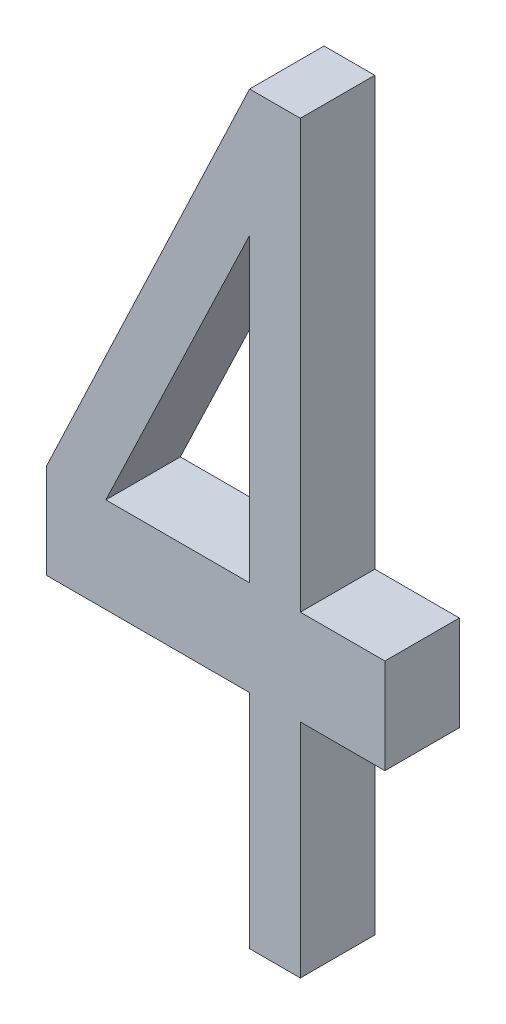
ISO-10303-21;
HEADER;
FILE_DESCRIPTION(('STEP AP214'),'2;1');
FILE_NAME('part.step','',(''),(''),'','','');
FILE_SCHEMA(('AUTOMOTIVE_DESIGN { 1 0 10303 214 1 1 1 1 }'));
ENDSEC;
DATA;
#1=APPLICATION_CONTEXT('core data for automotive mechanical design processes');
#2=APPLICATION_PROTOCOL_DEFINITION('international standard','automotive_design',2000,#1);
#3=PRODUCT_CONTEXT('',#1,'mechanical');
#4=PRODUCT('Part','Part','',(#3));
#5=PRODUCT_RELATED_PRODUCT_CATEGORY('part','',(#4));
#6=PRODUCT_DEFINITION_FORMATION('','',#4);
#7=PRODUCT_DEFINITION_CONTEXT('part definition',#1,'design');
#8=PRODUCT_DEFINITION('design','',#6,#7);
#9=PRODUCT_DEFINITION_SHAPE('','',#8);
#10=(LENGTH_UNIT() NAMED_UNIT(*) SI_UNIT(.MILLI.,.METRE.));
#11=(NAMED_UNIT(*) PLANE_ANGLE_UNIT() SI_UNIT($,.RADIAN.));
#12=(NAMED_UNIT(*) SI_UNIT($,.STERADIAN.) SOLID_ANGLE_UNIT());
#13=UNCERTAINTY_MEASURE_WITH_UNIT(LENGTH_MEASURE(1.E-05),#10,'distance_accuracy_value','');
#14=(GEOMETRIC_REPRESENTATION_CONTEXT(3) GLOBAL_UNCERTAINTY_ASSIGNED_CONTEXT((#13)) GLOBAL_UNIT_ASSIGNED_CONTEXT((#10,
#11,#12)) REPRESENTATION_CONTEXT('',''));
#15=CARTESIAN_POINT('',(0.,0.,0.));
#16=DIRECTION('',(0.,0.,1.));
#17=DIRECTION('',(1.,0.,0.));
#18=AXIS2_PLACEMENT_3D('',#15,#16,#17);
#19=CARTESIAN_POINT('',(-23.45554838855,-4.540425491333,-20.));
#20=DIRECTION('',(-1.,0.,0.));
#21=DIRECTION('',(0.,-1.,0.));
#22=AXIS2_PLACEMENT_3D('',#19,#20,#21);
#23=PLANE('',#22);
#24=DIRECTION('',(0.,-1.,0.));
#25=VECTOR('',#24,1.);
#26=CARTESIAN_POINT('',(-23.45554838855,-4.540425491333,-20.));
#27=LINE('',#26,#25);
#28=CARTESIAN_POINT('',(-23.45554838855,-4.540425491333,-20.));
#29=VERTEX_POINT('',#28);
#30=CARTESIAN_POINT('',(-23.45554838855,-5.348936152458,-20.));
#31=VERTEX_POINT('',#30);
#32=EDGE_CURVE('E11',#29,#31,#27,.T.);
#33=ORIENTED_EDGE('',*,*,#32,.T.);
#34=DIRECTION('',(0.,0.,1.));
#35=VECTOR('',#34,1.);
#36=CARTESIAN_POINT('',(-23.45554838855,-5.348936152458,-20.));
#37=LINE('',#36,#35);
#38=CARTESIAN_POINT('',(-23.45554838855,-5.348936152458,-19.8));
#39=VERTEX_POINT('',#38);
#40=EDGE_CURVE('E24',#31,#39,#37,.T.);
#41=ORIENTED_EDGE('',*,*,#40,.T.);
#42=DIRECTION('',(0.,-1.,0.));
#43=VECTOR('',#42,1.);
#44=CARTESIAN_POINT('',(-23.45554838855,-4.540425491333,-19.8));
#45=LINE('',#44,#43);
#46=CARTESIAN_POINT('',(-23.45554838855,-4.540425491333,-19.8));
#47=VERTEX_POINT('',#46);
#48=EDGE_CURVE('E222',#47,#39,#45,.T.);
#49=ORIENTED_EDGE('',*,*,#48,.F.);
#50=DIRECTION('',(0.,0.,1.));
#51=VECTOR('',#50,1.);
#52=CARTESIAN_POINT('',(-23.45554838855,-4.540425491333,-20.));
#53=LINE('',#52,#51);
#54=EDGE_CURVE('E219',#29,#47,#53,.T.);
#55=ORIENTED_EDGE('',*,*,#54,.F.);
#56=EDGE_LOOP('',(#33,#41,#49,#55));
#57=FACE_BOUND('',#56,.T.);
#58=ADVANCED_FACE('F17',(#57),#23,.T.);
#59=CARTESIAN_POINT('',(-23.45554838855,-5.348936152458,-20.));
#60=DIRECTION('',(0.,1.,0.));
#61=DIRECTION('',(-1.,0.,0.));
#62=AXIS2_PLACEMENT_3D('',#59,#60,#61);
#63=PLANE('',#62);
#64=DIRECTION('',(-1.,0.,0.));
#65=VECTOR('',#64,1.);
#66=CARTESIAN_POINT('',(-23.45554838855,-5.348936152458,-20.));
#67=LINE('',#66,#65);
#68=CARTESIAN_POINT('',(-23.84166125892,-5.348936152458,-20.));
#69=VERTEX_POINT('',#68);
#70=EDGE_CURVE('E217',#31,#69,#67,.T.);
#71=ORIENTED_EDGE('',*,*,#70,.T.);
#72=DIRECTION('',(0.,0.,1.));
#73=VECTOR('',#72,1.);
#74=CARTESIAN_POINT('',(-23.84166125892,-5.348936152458,-20.));
#75=LINE('',#74,#73);
#76=CARTESIAN_POINT('',(-23.84166125892,-5.348936152458,-19.8));
#77=VERTEX_POINT('',#76);
#78=EDGE_CURVE('E215',#69,#77,#75,.T.);
#79=ORIENTED_EDGE('',*,*,#78,.T.);
#80=DIRECTION('',(-1.,0.,0.));
#81=VECTOR('',#80,1.);
#82=CARTESIAN_POINT('',(-23.45554838855,-5.348936152458,-19.8));
#83=LINE('',#82,#81);
#84=EDGE_CURVE('E212',#39,#77,#83,.T.);
#85=ORIENTED_EDGE('',*,*,#84,.F.);
#86=ORIENTED_EDGE('',*,*,#40,.F.);
#87=EDGE_LOOP('',(#71,#79,#85,#86));
#88=FACE_BOUND('',#87,.T.);
#89=ADVANCED_FACE('F227',(#88),#63,.T.);
#90=CARTESIAN_POINT('',(-23.84166125892,-5.348936152458,-20.));
#91=DIRECTION('',(0.902380018852236,-0.430941181109717,0.));
#92=DIRECTION('',(0.430941181109717,0.902380018852236,0.));
#93=AXIS2_PLACEMENT_3D('',#90,#91,#92);
#94=PLANE('',#93);
#95=DIRECTION('',(0.430941181109717,0.902380018852236,0.));
#96=VECTOR('',#95,1.);
#97=CARTESIAN_POINT('',(-23.84166125892,-5.348936152458,-20.));
#98=LINE('',#97,#96);
#99=EDGE_CURVE('E209',#69,#29,#98,.T.);
#100=ORIENTED_EDGE('',*,*,#99,.T.);
#101=ORIENTED_EDGE('',*,*,#54,.T.);
#102=DIRECTION('',(0.430941181109717,0.902380018852236,0.));
#103=VECTOR('',#102,1.);
#104=CARTESIAN_POINT('',(-23.84166125892,-5.348936152458,-19.8));
#105=LINE('',#104,#103);
#106=EDGE_CURVE('E206',#77,#47,#105,.T.);
#107=ORIENTED_EDGE('',*,*,#106,.F.);
#108=ORIENTED_EDGE('',*,*,#78,.F.);
#109=EDGE_LOOP('',(#100,#101,#107,#108));
#110=FACE_BOUND('',#109,.T.);
#111=ADVANCED_FACE('F230',(#110),#94,.T.);
#112=CARTESIAN_POINT('',(-24.00064890761,-5.348936152458,-20.));
#113=DIRECTION('',(-1.,0.,0.));
#114=DIRECTION('',(0.,-1.,0.));
#115=AXIS2_PLACEMENT_3D('',#112,#113,#114);
#116=PLANE('',#115);
#117=DIRECTION('',(0.,-1.,0.));
#118=VECTOR('',#117,1.);
#119=CARTESIAN_POINT('',(-24.00064890761,-5.348936152458,-20.));
#120=LINE('',#119,#118);
#121=CARTESIAN_POINT('',(-24.00064890761,-5.348936152458,-20.));
#122=VERTEX_POINT('',#121);
#123=CARTESIAN_POINT('',(-24.00064890761,-5.604255330563,-20.));
#124=VERTEX_POINT('',#123);
#125=EDGE_CURVE('E204',#122,#124,#120,.T.);
#126=ORIENTED_EDGE('',*,*,#125,.T.);
#127=DIRECTION('',(0.,0.,1.));
#128=VECTOR('',#127,1.);
#129=CARTESIAN_POINT('',(-24.00064890761,-5.604255330563,-20.));
#130=LINE('',#129,#128);
#131=CARTESIAN_POINT('',(-24.00064890761,-5.604255330563,-19.8));
#132=VERTEX_POINT('',#131);
#133=EDGE_CURVE('E202',#124,#132,#130,.T.);
#134=ORIENTED_EDGE('',*,*,#133,.T.);
#135=DIRECTION('',(0.,-1.,0.));
#136=VECTOR('',#135,1.);
#137=CARTESIAN_POINT('',(-24.00064890761,-5.348936152458,-19.8));
#138=LINE('',#137,#136);
#139=CARTESIAN_POINT('',(-24.00064890761,-5.348936152458,-19.8));
#140=VERTEX_POINT('',#139);
#141=EDGE_CURVE('E200',#140,#132,#138,.T.);
#142=ORIENTED_EDGE('',*,*,#141,.F.);
#143=DIRECTION('',(0.,0.,1.));
#144=VECTOR('',#143,1.);
#145=CARTESIAN_POINT('',(-24.00064890761,-5.348936152458,-20.));
#146=LINE('',#145,#144);
#147=EDGE_CURVE('E141',#122,#140,#146,.T.);
#148=ORIENTED_EDGE('',*,*,#147,.F.);
#149=EDGE_LOOP('',(#126,#134,#142,#148));
#150=FACE_BOUND('',#149,.T.);
#151=ADVANCED_FACE('F247',(#150),#116,.T.);
#152=CARTESIAN_POINT('',(-24.00064890761,-5.604255330563,-20.));
#153=DIRECTION('',(0.,-1.,0.));
#154=DIRECTION('',(1.,0.,0.));
#155=AXIS2_PLACEMENT_3D('',#152,#153,#154);
#156=PLANE('',#155);
#157=DIRECTION('',(1.,0.,0.));
#158=VECTOR('',#157,1.);
#159=CARTESIAN_POINT('',(-24.00064890761,-5.604255330563,-20.));
#160=LINE('',#159,#158);
#161=CARTESIAN_POINT('',(-23.45554838855,-5.604255330563,-20.));
#162=VERTEX_POINT('',#161);
#163=EDGE_CURVE('E197',#124,#162,#160,.T.);
#164=ORIENTED_EDGE('',*,*,#163,.T.);
#165=DIRECTION('',(0.,0.,1.));
#166=VECTOR('',#165,1.);
#167=CARTESIAN_POINT('',(-23.45554838855,-5.604255330563,-20.));
#168=LINE('',#167,#166);
#169=CARTESIAN_POINT('',(-23.45554838855,-5.604255330563,-19.8));
#170=VERTEX_POINT('',#169);
#171=EDGE_CURVE('E195',#162,#170,#168,.T.);
#172=ORIENTED_EDGE('',*,*,#171,.T.);
#173=DIRECTION('',(1.,0.,0.));
#174=VECTOR('',#173,1.);
#175=CARTESIAN_POINT('',(-24.00064890761,-5.604255330563,-19.8));
#176=LINE('',#175,#174);
#177=EDGE_CURVE('E192',#132,#170,#176,.T.);
#178=ORIENTED_EDGE('',*,*,#177,.F.);
#179=ORIENTED_EDGE('',*,*,#133,.F.);
#180=EDGE_LOOP('',(#164,#172,#178,#179));
#181=FACE_BOUND('',#180,.T.);
#182=ADVANCED_FACE('F252',(#181),#156,.T.);
#183=CARTESIAN_POINT('',(-23.45554838855,-5.604255330563,-20.));
#184=DIRECTION('',(-1.,0.,0.));
#185=DIRECTION('',(0.,-1.,0.));
#186=AXIS2_PLACEMENT_3D('',#183,#184,#185);
#187=PLANE('',#186);
#188=DIRECTION('',(0.,-1.,0.));
#189=VECTOR('',#188,1.);
#190=CARTESIAN_POINT('',(-23.45554838855,-5.604255330563,-20.));
#191=LINE('',#190,#189);
#192=CARTESIAN_POINT('',(-23.45554838855,-6.2,-20.));
#193=VERTEX_POINT('',#192);
#194=EDGE_CURVE('E190',#162,#193,#191,.T.);
#195=ORIENTED_EDGE('',*,*,#194,.T.);
#196=DIRECTION('',(0.,0.,1.));
#197=VECTOR('',#196,1.);
#198=CARTESIAN_POINT('',(-23.45554838855,-6.2,-20.));
#199=LINE('',#198,#197);
#200=CARTESIAN_POINT('',(-23.45554838855,-6.2,-19.8));
#201=VERTEX_POINT('',#200);
#202=EDGE_CURVE('E188',#193,#201,#199,.T.);
#203=ORIENTED_EDGE('',*,*,#202,.T.);
#204=DIRECTION('',(0.,-1.,0.));
#205=VECTOR('',#204,1.);
#206=CARTESIAN_POINT('',(-23.45554838855,-5.604255330563,-19.8));
#207=LINE('',#206,#205);
#208=EDGE_CURVE('E185',#170,#201,#207,.T.);
#209=ORIENTED_EDGE('',*,*,#208,.F.);
#210=ORIENTED_EDGE('',*,*,#171,.F.);
#211=EDGE_LOOP('',(#195,#203,#209,#210));
#212=FACE_BOUND('',#211,.T.);
#213=ADVANCED_FACE('F256',(#212),#187,.T.);
#214=CARTESIAN_POINT('',(-23.45554838855,-6.2,-20.));
#215=DIRECTION('',(0.,-1.,0.));
#216=DIRECTION('',(1.,0.,0.));
#217=AXIS2_PLACEMENT_3D('',#214,#215,#216);
#218=PLANE('',#217);
#219=DIRECTION('',(1.,0.,0.));
#220=VECTOR('',#219,1.);
#221=CARTESIAN_POINT('',(-23.45554838855,-6.2,-20.));
#222=LINE('',#221,#220);
#223=CARTESIAN_POINT('',(-23.31927324254,-6.2,-20.));
#224=VERTEX_POINT('',#223);
#225=EDGE_CURVE('E183',#193,#224,#222,.T.);
#226=ORIENTED_EDGE('',*,*,#225,.T.);
#227=DIRECTION('',(0.,0.,1.));
#228=VECTOR('',#227,1.);
#229=CARTESIAN_POINT('',(-23.31927324254,-6.2,-20.));
#230=LINE('',#229,#228);
#231=CARTESIAN_POINT('',(-23.31927324254,-6.2,-19.8));
#232=VERTEX_POINT('',#231);
#233=EDGE_CURVE('E181',#224,#232,#230,.T.);
#234=ORIENTED_EDGE('',*,*,#233,.T.);
#235=DIRECTION('',(1.,0.,0.));
#236=VECTOR('',#235,1.);
#237=CARTESIAN_POINT('',(-23.45554838855,-6.2,-19.8));
#238=LINE('',#237,#236);
#239=EDGE_CURVE('E178',#201,#232,#238,.T.);
#240=ORIENTED_EDGE('',*,*,#239,.F.);
#241=ORIENTED_EDGE('',*,*,#202,.F.);
#242=EDGE_LOOP('',(#226,#234,#240,#241));
#243=FACE_BOUND('',#242,.T.);
#244=ADVANCED_FACE('F260',(#243),#218,.T.);
#245=CARTESIAN_POINT('',(-23.31927324254,-6.2,-20.));
#246=DIRECTION('',(1.,0.,0.));
#247=DIRECTION('',(0.,1.,0.));
#248=AXIS2_PLACEMENT_3D('',#245,#246,#247);
#249=PLANE('',#248);
#250=DIRECTION('',(0.,1.,0.));
#251=VECTOR('',#250,1.);
#252=CARTESIAN_POINT('',(-23.31927324254,-6.2,-20.));
#253=LINE('',#252,#251);
#254=CARTESIAN_POINT('',(-23.31927324254,-5.604255330563,-20.));
#255=VERTEX_POINT('',#254);
#256=EDGE_CURVE('E176',#224,#255,#253,.T.);
#257=ORIENTED_EDGE('',*,*,#256,.T.);
#258=DIRECTION('',(0.,0.,1.));
#259=VECTOR('',#258,1.);
#260=CARTESIAN_POINT('',(-23.31927324254,-5.604255330563,-20.));
#261=LINE('',#260,#259);
#262=CARTESIAN_POINT('',(-23.31927324254,-5.604255330563,-19.8));
#263=VERTEX_POINT('',#262);
#264=EDGE_CURVE('E174',#255,#263,#261,.T.);
#265=ORIENTED_EDGE('',*,*,#264,.T.);
#266=DIRECTION('',(0.,1.,0.));
#267=VECTOR('',#266,1.);
#268=CARTESIAN_POINT('',(-23.31927324254,-6.2,-19.8));
#269=LINE('',#268,#267);
#270=EDGE_CURVE('E171',#232,#263,#269,.T.);
#271=ORIENTED_EDGE('',*,*,#270,.F.);
#272=ORIENTED_EDGE('',*,*,#233,.F.);
#273=EDGE_LOOP('',(#257,#265,#271,#272));
#274=FACE_BOUND('',#273,.T.);
#275=ADVANCED_FACE('F264',(#274),#249,.T.);
#276=CARTESIAN_POINT('',(-23.31927324254,-5.604255330563,-20.));
#277=DIRECTION('',(0.,-1.,0.));
#278=DIRECTION('',(1.,0.,0.));
#279=AXIS2_PLACEMENT_3D('',#276,#277,#278);
#280=PLANE('',#279);
#281=DIRECTION('',(1.,0.,0.));
#282=VECTOR('',#281,1.);
#283=CARTESIAN_POINT('',(-23.31927324254,-5.604255330563,-20.));
#284=LINE('',#283,#282);
#285=CARTESIAN_POINT('',(-23.09214795587,-5.604255330563,-20.));
#286=VERTEX_POINT('',#285);
#287=EDGE_CURVE('E169',#255,#286,#284,.T.);
#288=ORIENTED_EDGE('',*,*,#287,.T.);
#289=DIRECTION('',(0.,0.,1.));
#290=VECTOR('',#289,1.);
#291=CARTESIAN_POINT('',(-23.09214795587,-5.604255330563,-20.));
#292=LINE('',#291,#290);
#293=CARTESIAN_POINT('',(-23.09214795587,-5.604255330563,-19.8));
#294=VERTEX_POINT('',#293);
#295=EDGE_CURVE('E167',#286,#294,#292,.T.);
#296=ORIENTED_EDGE('',*,*,#295,.T.);
#297=DIRECTION('',(1.,0.,0.));
#298=VECTOR('',#297,1.);
#299=CARTESIAN_POINT('',(-23.31927324254,-5.604255330563,-19.8));
#300=LINE('',#299,#298);
#301=EDGE_CURVE('E164',#263,#294,#300,.T.);
#302=ORIENTED_EDGE('',*,*,#301,.F.);
#303=ORIENTED_EDGE('',*,*,#264,.F.);
#304=EDGE_LOOP('',(#288,#296,#302,#303));
#305=FACE_BOUND('',#304,.T.);
#306=ADVANCED_FACE('F268',(#305),#280,.T.);
#307=CARTESIAN_POINT('',(-23.09214795587,-5.604255330563,-20.));
#308=DIRECTION('',(1.,0.,0.));
#309=DIRECTION('',(0.,1.,0.));
#310=AXIS2_PLACEMENT_3D('',#307,#308,#309);
#311=PLANE('',#310);
#312=DIRECTION('',(0.,1.,0.));
#313=VECTOR('',#312,1.);
#314=CARTESIAN_POINT('',(-23.09214795587,-5.604255330563,-20.));
#315=LINE('',#314,#313);
#316=CARTESIAN_POINT('',(-23.09214795587,-5.348936152458,-20.));
#317=VERTEX_POINT('',#316);
#318=EDGE_CURVE('E162',#286,#317,#315,.T.);
#319=ORIENTED_EDGE('',*,*,#318,.T.);
#320=DIRECTION('',(0.,0.,1.));
#321=VECTOR('',#320,1.);
#322=CARTESIAN_POINT('',(-23.09214795587,-5.348936152458,-20.));
#323=LINE('',#322,#321);
#324=CARTESIAN_POINT('',(-23.09214795587,-5.348936152458,-19.8));
#325=VERTEX_POINT('',#324);
#326=EDGE_CURVE('E160',#317,#325,#323,.T.);
#327=ORIENTED_EDGE('',*,*,#326,.T.);
#328=DIRECTION('',(0.,1.,0.));
#329=VECTOR('',#328,1.);
#330=CARTESIAN_POINT('',(-23.09214795587,-5.604255330563,-19.8));
#331=LINE('',#330,#329);
#332=EDGE_CURVE('E157',#294,#325,#331,.T.);
#333=ORIENTED_EDGE('',*,*,#332,.F.);
#334=ORIENTED_EDGE('',*,*,#295,.F.);
#335=EDGE_LOOP('',(#319,#327,#333,#334));
#336=FACE_BOUND('',#335,.T.);
#337=ADVANCED_FACE('F272',(#336),#311,.T.);
#338=CARTESIAN_POINT('',(-23.09214795587,-5.348936152458,-20.));
#339=DIRECTION('',(0.,1.,0.));
#340=DIRECTION('',(-1.,0.,0.));
#341=AXIS2_PLACEMENT_3D('',#338,#339,#340);
#342=PLANE('',#341);
#343=DIRECTION('',(-1.,0.,0.));
#344=VECTOR('',#343,1.);
#345=CARTESIAN_POINT('',(-23.09214795587,-5.348936152458,-20.));
#346=LINE('',#345,#344);
#347=CARTESIAN_POINT('',(-23.31927324254,-5.348936152458,-20.));
#348=VERTEX_POINT('',#347);
#349=EDGE_CURVE('E155',#317,#348,#346,.T.);
#350=ORIENTED_EDGE('',*,*,#349,.T.);
#351=DIRECTION('',(0.,0.,1.));
#352=VECTOR('',#351,1.);
#353=CARTESIAN_POINT('',(-23.31927324254,-5.348936152458,-20.));
#354=LINE('',#353,#352);
#355=CARTESIAN_POINT('',(-23.31927324254,-5.348936152458,-19.8));
#356=VERTEX_POINT('',#355);
#357=EDGE_CURVE('E153',#348,#356,#354,.T.);
#358=ORIENTED_EDGE('',*,*,#357,.T.);
#359=DIRECTION('',(-1.,0.,0.));
#360=VECTOR('',#359,1.);
#361=CARTESIAN_POINT('',(-23.09214795587,-5.348936152458,-19.8));
#362=LINE('',#361,#360);
#363=EDGE_CURVE('E151',#325,#356,#362,.T.);
#364=ORIENTED_EDGE('',*,*,#363,.F.);
#365=ORIENTED_EDGE('',*,*,#326,.F.);
#366=EDGE_LOOP('',(#350,#358,#364,#365));
#367=FACE_BOUND('',#366,.T.);
#368=ADVANCED_FACE('F276',(#367),#342,.T.);
#369=CARTESIAN_POINT('',(-23.31927324254,-5.348936152458,-20.));
#370=DIRECTION('',(1.,0.,0.));
#371=DIRECTION('',(0.,1.,0.));
#372=AXIS2_PLACEMENT_3D('',#369,#370,#371);
#373=PLANE('',#372);
#374=DIRECTION('',(0.,1.,0.));
#375=VECTOR('',#374,1.);
#376=CARTESIAN_POINT('',(-23.31927324254,-5.348936152458,-20.));
#377=LINE('',#376,#375);
#378=CARTESIAN_POINT('',(-23.31927324254,-4.2,-20.));
#379=VERTEX_POINT('',#378);
#380=EDGE_CURVE('E149',#348,#379,#377,.T.);
#381=ORIENTED_EDGE('',*,*,#380,.T.);
#382=DIRECTION('',(0.,0.,1.));
#383=VECTOR('',#382,1.);
#384=CARTESIAN_POINT('',(-23.31927324254,-4.2,-20.));
#385=LINE('',#384,#383);
#386=CARTESIAN_POINT('',(-23.31927324254,-4.2,-19.8));
#387=VERTEX_POINT('',#386);
#388=EDGE_CURVE('E147',#379,#387,#385,.T.);
#389=ORIENTED_EDGE('',*,*,#388,.T.);
#390=DIRECTION('',(0.,1.,0.));
#391=VECTOR('',#390,1.);
#392=CARTESIAN_POINT('',(-23.31927324254,-5.348936152458,-19.8));
#393=LINE('',#392,#391);
#394=EDGE_CURVE('E135',#356,#387,#393,.T.);
#395=ORIENTED_EDGE('',*,*,#394,.F.);
#396=ORIENTED_EDGE('',*,*,#357,.F.);
#397=EDGE_LOOP('',(#381,#389,#395,#396));
#398=FACE_BOUND('',#397,.T.);
#399=ADVANCED_FACE('F280',(#398),#373,.T.);
#400=CARTESIAN_POINT('',(-23.31927324254,-4.2,-20.));
#401=DIRECTION('',(0.,1.,0.));
#402=DIRECTION('',(-1.,0.,0.));
#403=AXIS2_PLACEMENT_3D('',#400,#401,#402);
#404=PLANE('',#403);
#405=DIRECTION('',(-1.,0.,0.));
#406=VECTOR('',#405,1.);
#407=CARTESIAN_POINT('',(-23.31927324254,-4.2,-20.));
#408=LINE('',#407,#406);
#409=CARTESIAN_POINT('',(-23.45554838855,-4.2,-20.));
#410=VERTEX_POINT('',#409);
#411=EDGE_CURVE('E120',#379,#410,#408,.T.);
#412=ORIENTED_EDGE('',*,*,#411,.T.);
#413=DIRECTION('',(0.,0.,1.));
#414=VECTOR('',#413,1.);
#415=CARTESIAN_POINT('',(-23.45554838855,-4.2,-20.));
#416=LINE('',#415,#414);
#417=CARTESIAN_POINT('',(-23.45554838855,-4.2,-19.8));
#418=VERTEX_POINT('',#417);
#419=EDGE_CURVE('E114',#410,#418,#416,.T.);
#420=ORIENTED_EDGE('',*,*,#419,.T.);
#421=DIRECTION('',(-1.,0.,0.));
#422=VECTOR('',#421,1.);
#423=CARTESIAN_POINT('',(-23.31927324254,-4.2,-19.8));
#424=LINE('',#423,#422);
#425=EDGE_CURVE('E118',#387,#418,#424,.T.);
#426=ORIENTED_EDGE('',*,*,#425,.F.);
#427=ORIENTED_EDGE('',*,*,#388,.F.);
#428=EDGE_LOOP('',(#412,#420,#426,#427));
#429=FACE_BOUND('',#428,.T.);
#430=ADVANCED_FACE('F116',(#429),#404,.T.);
#431=CARTESIAN_POINT('',(-23.45554838855,-4.2,-20.));
#432=DIRECTION('',(-0.903473720928992,0.428643483084396,0.));
#433=DIRECTION('',(-0.428643483084396,-0.903473720928992,0.));
#434=AXIS2_PLACEMENT_3D('',#431,#432,#433);
#435=PLANE('',#434);
#436=DIRECTION('',(-0.428643483084396,-0.903473720928992,0.));
#437=VECTOR('',#436,1.);
#438=CARTESIAN_POINT('',(-23.45554838855,-4.2,-20.));
#439=LINE('',#438,#437);
#440=EDGE_CURVE('E136',#410,#122,#439,.T.);
#441=ORIENTED_EDGE('',*,*,#440,.T.);
#442=ORIENTED_EDGE('',*,*,#147,.T.);
#443=DIRECTION('',(-0.428643483084396,-0.903473720928992,0.));
#444=VECTOR('',#443,1.);
#445=CARTESIAN_POINT('',(-23.45554838855,-4.2,-19.8));
#446=LINE('',#445,#444);
#447=EDGE_CURVE('E132',#418,#140,#446,.T.);
#448=ORIENTED_EDGE('',*,*,#447,.F.);
#449=ORIENTED_EDGE('',*,*,#419,.F.);
#450=EDGE_LOOP('',(#441,#442,#448,#449));
#451=FACE_BOUND('',#450,.T.);
#452=ADVANCED_FACE('F139',(#451),#435,.T.);
#453=CARTESIAN_POINT('',(0.,0.,-19.8));
#454=DIRECTION('',(0.,0.,1.));
#455=DIRECTION('',(1.,0.,0.));
#456=AXIS2_PLACEMENT_3D('',#453,#454,#455);
#457=PLANE('',#456);
#458=ORIENTED_EDGE('',*,*,#447,.T.);
#459=ORIENTED_EDGE('',*,*,#141,.T.);
#460=ORIENTED_EDGE('',*,*,#177,.T.);
#461=ORIENTED_EDGE('',*,*,#208,.T.);
#462=ORIENTED_EDGE('',*,*,#239,.T.);
#463=ORIENTED_EDGE('',*,*,#270,.T.);
#464=ORIENTED_EDGE('',*,*,#301,.T.);
#465=ORIENTED_EDGE('',*,*,#332,.T.);
#466=ORIENTED_EDGE('',*,*,#363,.T.);
#467=ORIENTED_EDGE('',*,*,#394,.T.);
#468=ORIENTED_EDGE('',*,*,#425,.T.);
#469=EDGE_LOOP('',(#458,#459,#460,#461,#462,#463,#464,#465,#466,#467,#468));
#470=FACE_BOUND('',#469,.T.);
#471=ORIENTED_EDGE('',*,*,#106,.T.);
#472=ORIENTED_EDGE('',*,*,#48,.T.);
#473=ORIENTED_EDGE('',*,*,#84,.T.);
#474=EDGE_LOOP('',(#471,#472,#473));
#475=FACE_BOUND('',#474,.T.);
#476=ADVANCED_FACE('F129',(#470,#475),#457,.T.);
#477=CARTESIAN_POINT('',(-1.04461879526,-0.712240098159247,-20.));
#478=DIRECTION('',(0.,0.,1.));
#479=DIRECTION('',(1.,0.,0.));
#480=AXIS2_PLACEMENT_3D('',#477,#478,#479);
#481=PLANE('',#480);
#482=ORIENTED_EDGE('',*,*,#440,.F.);
#483=ORIENTED_EDGE('',*,*,#411,.F.);
#484=ORIENTED_EDGE('',*,*,#380,.F.);
#485=ORIENTED_EDGE('',*,*,#349,.F.);
#486=ORIENTED_EDGE('',*,*,#318,.F.);
#487=ORIENTED_EDGE('',*,*,#287,.F.);
#488=ORIENTED_EDGE('',*,*,#256,.F.);
#489=ORIENTED_EDGE('',*,*,#225,.F.);
#490=ORIENTED_EDGE('',*,*,#194,.F.);
#491=ORIENTED_EDGE('',*,*,#163,.F.);
#492=ORIENTED_EDGE('',*,*,#125,.F.);
#493=EDGE_LOOP('',(#482,#483,#484,#485,#486,#487,#488,#489,#490,#491,#492));
#494=FACE_BOUND('',#493,.T.);
#495=ORIENTED_EDGE('',*,*,#99,.F.);
#496=ORIENTED_EDGE('',*,*,#70,.F.);
#497=ORIENTED_EDGE('',*,*,#32,.F.);
#498=EDGE_LOOP('',(#495,#496,#497));
#499=FACE_BOUND('',#498,.T.);
#500=ADVANCED_FACE('F231',(#494,#499),#481,.F.);
#501=CLOSED_SHELL('',(#58,#89,#111,#151,#182,#213,#244,#275,#306,#337,#368,#399,#430,#452,#476,#500));
#502=MANIFOLD_SOLID_BREP('B1',#501);
#503=ADVANCED_BREP_SHAPE_REPRESENTATION('',(#18,#502),#14);
#504=SHAPE_DEFINITION_REPRESENTATION(#9,#503);
ENDSEC;
END-ISO-10303-21;
